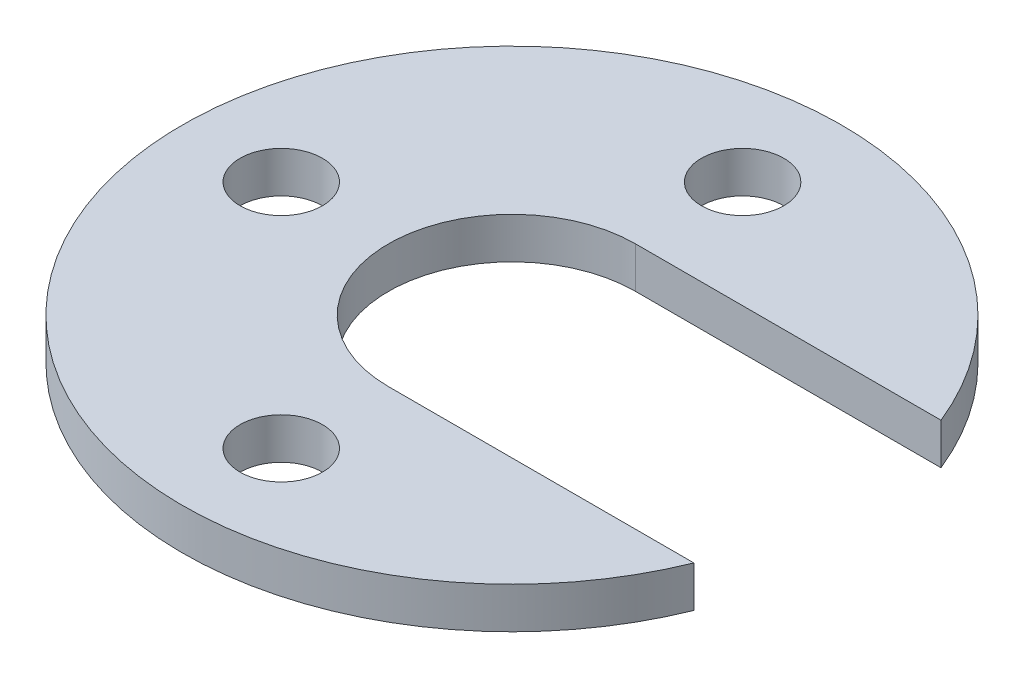
ISO-10303-21;
HEADER;
FILE_DESCRIPTION(('STEP AP214'),'2;1');
FILE_NAME('part.step','',(''),(''),'','','');
FILE_SCHEMA(('AUTOMOTIVE_DESIGN { 1 0 10303 214 1 1 1 1 }'));
ENDSEC;
DATA;
#1=APPLICATION_CONTEXT('core data for automotive mechanical design processes');
#2=APPLICATION_PROTOCOL_DEFINITION('international standard','automotive_design',2000,#1);
#3=PRODUCT_CONTEXT('',#1,'mechanical');
#4=PRODUCT('Part','Part','',(#3));
#5=PRODUCT_RELATED_PRODUCT_CATEGORY('part','',(#4));
#6=PRODUCT_DEFINITION_FORMATION('','',#4);
#7=PRODUCT_DEFINITION_CONTEXT('part definition',#1,'design');
#8=PRODUCT_DEFINITION('design','',#6,#7);
#9=PRODUCT_DEFINITION_SHAPE('','',#8);
#10=(LENGTH_UNIT() NAMED_UNIT(*) SI_UNIT(.MILLI.,.METRE.));
#11=(NAMED_UNIT(*) PLANE_ANGLE_UNIT() SI_UNIT($,.RADIAN.));
#12=(NAMED_UNIT(*) SI_UNIT($,.STERADIAN.) SOLID_ANGLE_UNIT());
#13=UNCERTAINTY_MEASURE_WITH_UNIT(LENGTH_MEASURE(1.E-05),#10,'distance_accuracy_value','');
#14=(GEOMETRIC_REPRESENTATION_CONTEXT(3) GLOBAL_UNCERTAINTY_ASSIGNED_CONTEXT((#13)) GLOBAL_UNIT_ASSIGNED_CONTEXT((#10,
#11,#12)) REPRESENTATION_CONTEXT('',''));
#15=CARTESIAN_POINT('',(0.,0.,0.));
#16=DIRECTION('',(0.,0.,1.));
#17=DIRECTION('',(1.,0.,0.));
#18=AXIS2_PLACEMENT_3D('',#15,#16,#17);
#19=CARTESIAN_POINT('',(0.,5.,0.));
#20=DIRECTION('',(0.,1.,0.));
#21=DIRECTION('',(0.,0.,1.));
#22=AXIS2_PLACEMENT_3D('',#19,#20,#21);
#23=PLANE('',#22);
#24=CARTESIAN_POINT('',(0.,5.,-28.));
#25=DIRECTION('',(0.,1.,0.));
#26=DIRECTION('',(0.,0.,1.));
#27=AXIS2_PLACEMENT_3D('',#24,#25,#26);
#28=CIRCLE('',#27,5.);
#29=CARTESIAN_POINT('',(0.,5.,-23.));
#30=VERTEX_POINT('',#29);
#31=EDGE_CURVE('E119',#30,#30,#28,.T.);
#32=ORIENTED_EDGE('',*,*,#31,.F.);
#33=EDGE_LOOP('',(#32));
#34=FACE_BOUND('',#33,.T.);
#35=CARTESIAN_POINT('',(0.,5.,0.));
#36=DIRECTION('',(0.,-1.,0.));
#37=DIRECTION('',(0.,0.,1.));
#38=AXIS2_PLACEMENT_3D('',#35,#36,#37);
#39=CIRCLE('',#38,15.);
#40=CARTESIAN_POINT('',(0.,5.,15.));
#41=VERTEX_POINT('',#40);
#42=CARTESIAN_POINT('',(0.,5.,-15.));
#43=VERTEX_POINT('',#42);
#44=EDGE_CURVE('E89',#41,#43,#39,.T.);
#45=ORIENTED_EDGE('',*,*,#44,.T.);
#46=DIRECTION('',(1.,0.,0.));
#47=VECTOR('',#46,1.);
#48=CARTESIAN_POINT('',(0.,5.,-15.));
#49=LINE('',#48,#47);
#50=CARTESIAN_POINT('',(37.0809924354783,5.,-15.));
#51=VERTEX_POINT('',#50);
#52=EDGE_CURVE('E84',#43,#51,#49,.T.);
#53=ORIENTED_EDGE('',*,*,#52,.T.);
#54=CARTESIAN_POINT('',(0.,5.,0.));
#55=DIRECTION('',(0.,1.,0.));
#56=DIRECTION('',(0.,0.,1.));
#57=AXIS2_PLACEMENT_3D('',#54,#55,#56);
#58=CIRCLE('',#57,40.);
#59=CARTESIAN_POINT('',(37.0809924354783,5.,15.));
#60=VERTEX_POINT('',#59);
#61=EDGE_CURVE('E87',#51,#60,#58,.T.);
#62=ORIENTED_EDGE('',*,*,#61,.T.);
#63=DIRECTION('',(-1.,0.,0.));
#64=VECTOR('',#63,1.);
#65=CARTESIAN_POINT('',(0.,5.,15.));
#66=LINE('',#65,#64);
#67=EDGE_CURVE('E54',#60,#41,#66,.T.);
#68=ORIENTED_EDGE('',*,*,#67,.T.);
#69=EDGE_LOOP('',(#45,#53,#62,#68));
#70=FACE_BOUND('',#69,.T.);
#71=CARTESIAN_POINT('',(-28.,5.,0.));
#72=DIRECTION('',(0.,1.,0.));
#73=DIRECTION('',(0.,0.,1.));
#74=AXIS2_PLACEMENT_3D('',#71,#72,#73);
#75=CIRCLE('',#74,5.);
#76=CARTESIAN_POINT('',(-28.,5.,5.));
#77=VERTEX_POINT('',#76);
#78=EDGE_CURVE('E104',#77,#77,#75,.T.);
#79=ORIENTED_EDGE('',*,*,#78,.F.);
#80=EDGE_LOOP('',(#79));
#81=FACE_BOUND('',#80,.T.);
#82=CARTESIAN_POINT('',(-2.93284432462823E-13,5.,28.));
#83=DIRECTION('',(0.,1.,0.));
#84=DIRECTION('',(0.,0.,1.));
#85=AXIS2_PLACEMENT_3D('',#82,#83,#84);
#86=CIRCLE('',#85,5.);
#87=CARTESIAN_POINT('',(-2.93284432462823E-13,5.,33.));
#88=VERTEX_POINT('',#87);
#89=EDGE_CURVE('E125',#88,#88,#86,.T.);
#90=ORIENTED_EDGE('',*,*,#89,.F.);
#91=EDGE_LOOP('',(#90));
#92=FACE_BOUND('',#91,.T.);
#93=ADVANCED_FACE('F37',(#34,#70,#81,#92),#23,.T.);
#94=CARTESIAN_POINT('',(0.,0.,0.));
#95=DIRECTION('',(0.,1.,0.));
#96=DIRECTION('',(0.,0.,1.));
#97=AXIS2_PLACEMENT_3D('',#94,#95,#96);
#98=PLANE('',#97);
#99=CARTESIAN_POINT('',(0.,0.,0.));
#100=DIRECTION('',(0.,-1.,0.));
#101=DIRECTION('',(0.,0.,1.));
#102=AXIS2_PLACEMENT_3D('',#99,#100,#101);
#103=CIRCLE('',#102,15.);
#104=CARTESIAN_POINT('',(0.,0.,15.));
#105=VERTEX_POINT('',#104);
#106=CARTESIAN_POINT('',(0.,0.,-15.));
#107=VERTEX_POINT('',#106);
#108=EDGE_CURVE('E101',#105,#107,#103,.T.);
#109=ORIENTED_EDGE('',*,*,#108,.F.);
#110=DIRECTION('',(-1.,0.,0.));
#111=VECTOR('',#110,1.);
#112=CARTESIAN_POINT('',(0.,0.,15.));
#113=LINE('',#112,#111);
#114=CARTESIAN_POINT('',(37.0809924354783,0.,15.));
#115=VERTEX_POINT('',#114);
#116=EDGE_CURVE('E77',#115,#105,#113,.T.);
#117=ORIENTED_EDGE('',*,*,#116,.F.);
#118=CARTESIAN_POINT('',(0.,0.,0.));
#119=DIRECTION('',(0.,1.,0.));
#120=DIRECTION('',(0.,0.,1.));
#121=AXIS2_PLACEMENT_3D('',#118,#119,#120);
#122=CIRCLE('',#121,40.);
#123=CARTESIAN_POINT('',(37.0809924354783,0.,-15.));
#124=VERTEX_POINT('',#123);
#125=EDGE_CURVE('E71',#124,#115,#122,.T.);
#126=ORIENTED_EDGE('',*,*,#125,.F.);
#127=DIRECTION('',(1.,0.,0.));
#128=VECTOR('',#127,1.);
#129=CARTESIAN_POINT('',(0.,0.,-15.));
#130=LINE('',#129,#128);
#131=EDGE_CURVE('E93',#107,#124,#130,.T.);
#132=ORIENTED_EDGE('',*,*,#131,.F.);
#133=EDGE_LOOP('',(#109,#117,#126,#132));
#134=FACE_BOUND('',#133,.T.);
#135=CARTESIAN_POINT('',(-28.,0.,0.));
#136=DIRECTION('',(0.,1.,0.));
#137=DIRECTION('',(0.,0.,1.));
#138=AXIS2_PLACEMENT_3D('',#135,#136,#137);
#139=CIRCLE('',#138,5.);
#140=CARTESIAN_POINT('',(-28.,0.,5.));
#141=VERTEX_POINT('',#140);
#142=EDGE_CURVE('E116',#141,#141,#139,.T.);
#143=ORIENTED_EDGE('',*,*,#142,.T.);
#144=EDGE_LOOP('',(#143));
#145=FACE_BOUND('',#144,.T.);
#146=CARTESIAN_POINT('',(0.,0.,-28.));
#147=DIRECTION('',(0.,1.,0.));
#148=DIRECTION('',(0.,0.,1.));
#149=AXIS2_PLACEMENT_3D('',#146,#147,#148);
#150=CIRCLE('',#149,5.);
#151=CARTESIAN_POINT('',(0.,0.,-23.));
#152=VERTEX_POINT('',#151);
#153=EDGE_CURVE('E122',#152,#152,#150,.T.);
#154=ORIENTED_EDGE('',*,*,#153,.T.);
#155=EDGE_LOOP('',(#154));
#156=FACE_BOUND('',#155,.T.);
#157=CARTESIAN_POINT('',(-2.93284432462823E-13,0.,28.));
#158=DIRECTION('',(0.,1.,0.));
#159=DIRECTION('',(0.,0.,1.));
#160=AXIS2_PLACEMENT_3D('',#157,#158,#159);
#161=CIRCLE('',#160,5.);
#162=CARTESIAN_POINT('',(-2.93284432462823E-13,0.,33.));
#163=VERTEX_POINT('',#162);
#164=EDGE_CURVE('E128',#163,#163,#161,.T.);
#165=ORIENTED_EDGE('',*,*,#164,.T.);
#166=EDGE_LOOP('',(#165));
#167=FACE_BOUND('',#166,.T.);
#168=ADVANCED_FACE('F112',(#134,#145,#156,#167),#98,.F.);
#169=CARTESIAN_POINT('',(0.,5.,0.));
#170=DIRECTION('',(0.,-1.,0.));
#171=DIRECTION('',(0.,0.,-1.));
#172=AXIS2_PLACEMENT_3D('',#169,#170,#171);
#173=CYLINDRICAL_SURFACE('',#172,15.);
#174=ORIENTED_EDGE('',*,*,#108,.T.);
#175=DIRECTION('',(0.,-1.,0.));
#176=VECTOR('',#175,1.);
#177=CARTESIAN_POINT('',(0.,5.,-15.));
#178=LINE('',#177,#176);
#179=EDGE_CURVE('E11',#43,#107,#178,.T.);
#180=ORIENTED_EDGE('',*,*,#179,.F.);
#181=ORIENTED_EDGE('',*,*,#44,.F.);
#182=DIRECTION('',(0.,-1.,0.));
#183=VECTOR('',#182,1.);
#184=CARTESIAN_POINT('',(0.,5.,15.));
#185=LINE('',#184,#183);
#186=EDGE_CURVE('E97',#41,#105,#185,.T.);
#187=ORIENTED_EDGE('',*,*,#186,.T.);
#188=EDGE_LOOP('',(#174,#180,#181,#187));
#189=FACE_BOUND('',#188,.T.);
#190=ADVANCED_FACE('F39',(#189),#173,.F.);
#191=CARTESIAN_POINT('',(0.,5.,-15.));
#192=DIRECTION('',(0.,0.,-1.));
#193=DIRECTION('',(-1.,0.,0.));
#194=AXIS2_PLACEMENT_3D('',#191,#192,#193);
#195=PLANE('',#194);
#196=ORIENTED_EDGE('',*,*,#131,.T.);
#197=DIRECTION('',(0.,-1.,0.));
#198=VECTOR('',#197,1.);
#199=CARTESIAN_POINT('',(37.0809924354783,5.,-15.));
#200=LINE('',#199,#198);
#201=EDGE_CURVE('E46',#51,#124,#200,.T.);
#202=ORIENTED_EDGE('',*,*,#201,.F.);
#203=ORIENTED_EDGE('',*,*,#52,.F.);
#204=ORIENTED_EDGE('',*,*,#179,.T.);
#205=EDGE_LOOP('',(#196,#202,#203,#204));
#206=FACE_BOUND('',#205,.T.);
#207=ADVANCED_FACE('F92',(#206),#195,.F.);
#208=CARTESIAN_POINT('',(0.,5.,0.));
#209=DIRECTION('',(0.,-1.,0.));
#210=DIRECTION('',(0.,0.,-1.));
#211=AXIS2_PLACEMENT_3D('',#208,#209,#210);
#212=CYLINDRICAL_SURFACE('',#211,40.);
#213=ORIENTED_EDGE('',*,*,#125,.T.);
#214=DIRECTION('',(0.,-1.,0.));
#215=VECTOR('',#214,1.);
#216=CARTESIAN_POINT('',(37.0809924354783,5.,15.));
#217=LINE('',#216,#215);
#218=EDGE_CURVE('E94',#60,#115,#217,.T.);
#219=ORIENTED_EDGE('',*,*,#218,.F.);
#220=ORIENTED_EDGE('',*,*,#61,.F.);
#221=ORIENTED_EDGE('',*,*,#201,.T.);
#222=EDGE_LOOP('',(#213,#219,#220,#221));
#223=FACE_BOUND('',#222,.T.);
#224=ADVANCED_FACE('F95',(#223),#212,.T.);
#225=CARTESIAN_POINT('',(0.,5.,15.));
#226=DIRECTION('',(0.,0.,1.));
#227=DIRECTION('',(1.,0.,0.));
#228=AXIS2_PLACEMENT_3D('',#225,#226,#227);
#229=PLANE('',#228);
#230=ORIENTED_EDGE('',*,*,#116,.T.);
#231=ORIENTED_EDGE('',*,*,#186,.F.);
#232=ORIENTED_EDGE('',*,*,#67,.F.);
#233=ORIENTED_EDGE('',*,*,#218,.T.);
#234=EDGE_LOOP('',(#230,#231,#232,#233));
#235=FACE_BOUND('',#234,.T.);
#236=ADVANCED_FACE('F109',(#235),#229,.F.);
#237=CARTESIAN_POINT('',(-28.,5.,0.));
#238=DIRECTION('',(0.,-1.,0.));
#239=DIRECTION('',(0.,0.,-1.));
#240=AXIS2_PLACEMENT_3D('',#237,#238,#239);
#241=CYLINDRICAL_SURFACE('',#240,5.);
#242=ORIENTED_EDGE('',*,*,#78,.T.);
#243=EDGE_LOOP('',(#242));
#244=FACE_BOUND('',#243,.T.);
#245=ORIENTED_EDGE('',*,*,#142,.F.);
#246=EDGE_LOOP('',(#245));
#247=FACE_BOUND('',#246,.T.);
#248=ADVANCED_FACE('F146',(#244,#247),#241,.F.);
#249=CARTESIAN_POINT('',(0.,5.,-28.));
#250=DIRECTION('',(0.,-1.,0.));
#251=DIRECTION('',(0.,0.,-1.));
#252=AXIS2_PLACEMENT_3D('',#249,#250,#251);
#253=CYLINDRICAL_SURFACE('',#252,5.);
#254=ORIENTED_EDGE('',*,*,#31,.T.);
#255=EDGE_LOOP('',(#254));
#256=FACE_BOUND('',#255,.T.);
#257=ORIENTED_EDGE('',*,*,#153,.F.);
#258=EDGE_LOOP('',(#257));
#259=FACE_BOUND('',#258,.T.);
#260=ADVANCED_FACE('F200',(#256,#259),#253,.F.);
#261=CARTESIAN_POINT('',(-2.93284432462823E-13,5.,28.));
#262=DIRECTION('',(0.,-1.,0.));
#263=DIRECTION('',(0.,0.,-1.));
#264=AXIS2_PLACEMENT_3D('',#261,#262,#263);
#265=CYLINDRICAL_SURFACE('',#264,5.);
#266=ORIENTED_EDGE('',*,*,#89,.T.);
#267=EDGE_LOOP('',(#266));
#268=FACE_BOUND('',#267,.T.);
#269=ORIENTED_EDGE('',*,*,#164,.F.);
#270=EDGE_LOOP('',(#269));
#271=FACE_BOUND('',#270,.T.);
#272=ADVANCED_FACE('F134',(#268,#271),#265,.F.);
#273=CLOSED_SHELL('',(#93,#168,#190,#207,#224,#236,#248,#260,#272));
#274=MANIFOLD_SOLID_BREP('B2',#273);
#275=ADVANCED_BREP_SHAPE_REPRESENTATION('',(#18,#274),#14);
#276=SHAPE_DEFINITION_REPRESENTATION(#9,#275);
ENDSEC;
END-ISO-10303-21;
